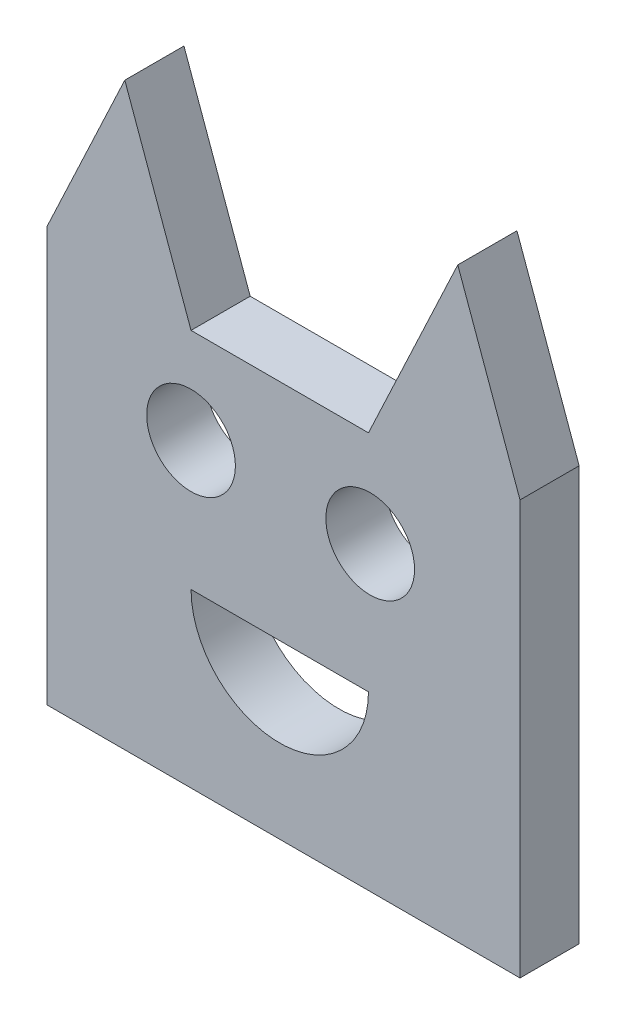
ISO-10303-21;
HEADER;
FILE_DESCRIPTION(('STEP AP214'),'2;1');
FILE_NAME('part.step','',(''),(''),'','','');
FILE_SCHEMA(('AUTOMOTIVE_DESIGN { 1 0 10303 214 1 1 1 1 }'));
ENDSEC;
DATA;
#1=APPLICATION_CONTEXT('core data for automotive mechanical design processes');
#2=APPLICATION_PROTOCOL_DEFINITION('international standard','automotive_design',2000,#1);
#3=PRODUCT_CONTEXT('',#1,'mechanical');
#4=PRODUCT('Part','Part','',(#3));
#5=PRODUCT_RELATED_PRODUCT_CATEGORY('part','',(#4));
#6=PRODUCT_DEFINITION_FORMATION('','',#4);
#7=PRODUCT_DEFINITION_CONTEXT('part definition',#1,'design');
#8=PRODUCT_DEFINITION('design','',#6,#7);
#9=PRODUCT_DEFINITION_SHAPE('','',#8);
#10=(LENGTH_UNIT() NAMED_UNIT(*) SI_UNIT(.MILLI.,.METRE.));
#11=(NAMED_UNIT(*) PLANE_ANGLE_UNIT() SI_UNIT($,.RADIAN.));
#12=(NAMED_UNIT(*) SI_UNIT($,.STERADIAN.) SOLID_ANGLE_UNIT());
#13=UNCERTAINTY_MEASURE_WITH_UNIT(LENGTH_MEASURE(1.E-05),#10,'distance_accuracy_value','');
#14=(GEOMETRIC_REPRESENTATION_CONTEXT(3) GLOBAL_UNCERTAINTY_ASSIGNED_CONTEXT((#13)) GLOBAL_UNIT_ASSIGNED_CONTEXT((#10,
#11,#12)) REPRESENTATION_CONTEXT('',''));
#15=CARTESIAN_POINT('',(0.,0.,0.));
#16=DIRECTION('',(0.,0.,1.));
#17=DIRECTION('',(1.,0.,0.));
#18=AXIS2_PLACEMENT_3D('',#15,#16,#17);
#19=CARTESIAN_POINT('',(15.6205948019353,-67.0160214677558,-10.));
#20=DIRECTION('',(0.,-1.,0.));
#21=DIRECTION('',(0.,0.,-1.));
#22=AXIS2_PLACEMENT_3D('',#19,#20,#21);
#23=PLANE('',#22);
#24=DIRECTION('',(1.,0.,0.));
#25=VECTOR('',#24,1.);
#26=CARTESIAN_POINT('',(15.6205948019353,-67.0160214677558,0.));
#27=LINE('',#26,#25);
#28=CARTESIAN_POINT('',(-24.3794051980646,-67.0160214677558,0.));
#29=VERTEX_POINT('',#28);
#30=CARTESIAN_POINT('',(55.6205948019354,-67.0160214677558,0.));
#31=VERTEX_POINT('',#30);
#32=EDGE_CURVE('E153',#29,#31,#27,.T.);
#33=ORIENTED_EDGE('',*,*,#32,.F.);
#34=DIRECTION('',(0.,0.,1.));
#35=VECTOR('',#34,1.);
#36=CARTESIAN_POINT('',(-24.3794051980646,-67.0160214677558,-10.));
#37=LINE('',#36,#35);
#38=CARTESIAN_POINT('',(-24.3794051980646,-67.0160214677558,-10.));
#39=VERTEX_POINT('',#38);
#40=EDGE_CURVE('E11',#39,#29,#37,.T.);
#41=ORIENTED_EDGE('',*,*,#40,.F.);
#42=DIRECTION('',(1.,0.,0.));
#43=VECTOR('',#42,1.);
#44=CARTESIAN_POINT('',(15.6205948019353,-67.0160214677558,-10.));
#45=LINE('',#44,#43);
#46=CARTESIAN_POINT('',(55.6205948019354,-67.0160214677558,-10.));
#47=VERTEX_POINT('',#46);
#48=EDGE_CURVE('E232',#39,#47,#45,.T.);
#49=ORIENTED_EDGE('',*,*,#48,.T.);
#50=DIRECTION('',(0.,0.,1.));
#51=VECTOR('',#50,1.);
#52=CARTESIAN_POINT('',(55.6205948019354,-67.0160214677558,-10.));
#53=LINE('',#52,#51);
#54=EDGE_CURVE('E185',#47,#31,#53,.T.);
#55=ORIENTED_EDGE('',*,*,#54,.T.);
#56=EDGE_LOOP('',(#33,#41,#49,#55));
#57=FACE_BOUND('',#56,.T.);
#58=ADVANCED_FACE('F31',(#57),#23,.T.);
#59=CARTESIAN_POINT('',(-24.3794051980646,-116.677394045434,-10.));
#60=DIRECTION('',(-1.,0.,0.));
#61=DIRECTION('',(0.,0.,1.));
#62=AXIS2_PLACEMENT_3D('',#59,#60,#61);
#63=PLANE('',#62);
#64=DIRECTION('',(0.,-1.,0.));
#65=VECTOR('',#64,1.);
#66=CARTESIAN_POINT('',(-24.3794051980646,-116.677394045434,0.));
#67=LINE('',#66,#65);
#68=CARTESIAN_POINT('',(-24.3794051980646,2.98397853224426,0.));
#69=VERTEX_POINT('',#68);
#70=EDGE_CURVE('E171',#69,#29,#67,.T.);
#71=ORIENTED_EDGE('',*,*,#70,.F.);
#72=DIRECTION('',(0.,0.,1.));
#73=VECTOR('',#72,1.);
#74=CARTESIAN_POINT('',(-24.3794051980646,2.98397853224426,-10.));
#75=LINE('',#74,#73);
#76=CARTESIAN_POINT('',(-24.3794051980646,2.98397853224426,-10.));
#77=VERTEX_POINT('',#76);
#78=EDGE_CURVE('E41',#77,#69,#75,.T.);
#79=ORIENTED_EDGE('',*,*,#78,.F.);
#80=DIRECTION('',(0.,-1.,0.));
#81=VECTOR('',#80,1.);
#82=CARTESIAN_POINT('',(-24.3794051980646,-116.677394045434,-10.));
#83=LINE('',#82,#81);
#84=EDGE_CURVE('E130',#77,#39,#83,.T.);
#85=ORIENTED_EDGE('',*,*,#84,.T.);
#86=ORIENTED_EDGE('',*,*,#40,.T.);
#87=EDGE_LOOP('',(#71,#79,#85,#86));
#88=FACE_BOUND('',#87,.T.);
#89=ADVANCED_FACE('F208',(#88),#63,.T.);
#90=CARTESIAN_POINT('',(-63.1993701005455,-79.6485223919343,-10.));
#91=DIRECTION('',(-0.905096679918776,0.425205832509396,0.));
#92=DIRECTION('',(-0.425205832509396,-0.905096679918776,0.));
#93=AXIS2_PLACEMENT_3D('',#90,#91,#92);
#94=PLANE('',#93);
#95=DIRECTION('',(-0.425205832509396,-0.905096679918776,0.));
#96=VECTOR('',#95,1.);
#97=CARTESIAN_POINT('',(-63.1993701005455,-79.6485223919343,0.));
#98=LINE('',#97,#96);
#99=CARTESIAN_POINT('',(-11.1980243902734,31.0419756097263,0.));
#100=VERTEX_POINT('',#99);
#101=EDGE_CURVE('E118',#100,#69,#98,.T.);
#102=ORIENTED_EDGE('',*,*,#101,.F.);
#103=DIRECTION('',(0.,0.,1.));
#104=VECTOR('',#103,1.);
#105=CARTESIAN_POINT('',(-11.1980243902734,31.0419756097263,-10.));
#106=LINE('',#105,#104);
#107=CARTESIAN_POINT('',(-11.1980243902734,31.0419756097263,-10.));
#108=VERTEX_POINT('',#107);
#109=EDGE_CURVE('E113',#108,#100,#106,.T.);
#110=ORIENTED_EDGE('',*,*,#109,.F.);
#111=DIRECTION('',(-0.425205832509396,-0.905096679918776,0.));
#112=VECTOR('',#111,1.);
#113=CARTESIAN_POINT('',(-63.1993701005455,-79.6485223919343,-10.));
#114=LINE('',#113,#112);
#115=EDGE_CURVE('E116',#108,#77,#114,.T.);
#116=ORIENTED_EDGE('',*,*,#115,.T.);
#117=ORIENTED_EDGE('',*,*,#78,.T.);
#118=EDGE_LOOP('',(#102,#110,#116,#117));
#119=FACE_BOUND('',#118,.T.);
#120=ADVANCED_FACE('F115',(#119),#94,.T.);
#121=CARTESIAN_POINT('',(39.0420983799109,-108.228364524231,-10.));
#122=DIRECTION('',(0.940665927567464,0.339334072432526,0.));
#123=DIRECTION('',(-0.339334072432526,0.940665927567464,0.));
#124=AXIS2_PLACEMENT_3D('',#121,#122,#123);
#125=PLANE('',#124);
#126=DIRECTION('',(-0.339334072432526,0.940665927567464,0.));
#127=VECTOR('',#126,1.);
#128=CARTESIAN_POINT('',(39.0420983799109,-108.228364524231,0.));
#129=LINE('',#128,#127);
#130=CARTESIAN_POINT('',(0.,0.,0.));
#131=VERTEX_POINT('',#130);
#132=EDGE_CURVE('E168',#131,#100,#129,.T.);
#133=ORIENTED_EDGE('',*,*,#132,.F.);
#134=DIRECTION('',(0.,0.,1.));
#135=VECTOR('',#134,1.);
#136=CARTESIAN_POINT('',(0.,0.,-10.));
#137=LINE('',#136,#135);
#138=CARTESIAN_POINT('',(0.,0.,-10.));
#139=VERTEX_POINT('',#138);
#140=EDGE_CURVE('E123',#139,#131,#137,.T.);
#141=ORIENTED_EDGE('',*,*,#140,.F.);
#142=DIRECTION('',(-0.339334072432526,0.940665927567464,0.));
#143=VECTOR('',#142,1.);
#144=CARTESIAN_POINT('',(39.0420983799109,-108.228364524231,-10.));
#145=LINE('',#144,#143);
#146=EDGE_CURVE('E129',#139,#108,#145,.T.);
#147=ORIENTED_EDGE('',*,*,#146,.T.);
#148=ORIENTED_EDGE('',*,*,#109,.T.);
#149=EDGE_LOOP('',(#133,#141,#147,#148));
#150=FACE_BOUND('',#149,.T.);
#151=ADVANCED_FACE('F132',(#150),#125,.T.);
#152=CARTESIAN_POINT('',(15.6205948019353,0.,-10.));
#153=DIRECTION('',(0.,-1.,0.));
#154=DIRECTION('',(0.,0.,-1.));
#155=AXIS2_PLACEMENT_3D('',#152,#153,#154);
#156=PLANE('',#155);
#157=DIRECTION('',(1.,0.,0.));
#158=VECTOR('',#157,1.);
#159=CARTESIAN_POINT('',(15.6205948019353,0.,0.));
#160=LINE('',#159,#158);
#161=CARTESIAN_POINT('',(30.,0.,0.));
#162=VERTEX_POINT('',#161);
#163=EDGE_CURVE('E165',#131,#162,#160,.T.);
#164=ORIENTED_EDGE('',*,*,#163,.T.);
#165=DIRECTION('',(0.,0.,1.));
#166=VECTOR('',#165,1.);
#167=CARTESIAN_POINT('',(30.,0.,-10.));
#168=LINE('',#167,#166);
#169=CARTESIAN_POINT('',(30.,0.,-10.));
#170=VERTEX_POINT('',#169);
#171=EDGE_CURVE('E177',#170,#162,#168,.T.);
#172=ORIENTED_EDGE('',*,*,#171,.F.);
#173=DIRECTION('',(1.,0.,0.));
#174=VECTOR('',#173,1.);
#175=CARTESIAN_POINT('',(15.6205948019353,0.,-10.));
#176=LINE('',#175,#174);
#177=EDGE_CURVE('E134',#139,#170,#176,.T.);
#178=ORIENTED_EDGE('',*,*,#177,.F.);
#179=ORIENTED_EDGE('',*,*,#140,.T.);
#180=EDGE_LOOP('',(#164,#172,#178,#179));
#181=FACE_BOUND('',#180,.T.);
#182=ADVANCED_FACE('F245',(#181),#156,.F.);
#183=CARTESIAN_POINT('',(-17.503370100546,-101.116069620251,-10.));
#184=DIRECTION('',(0.905096679918776,-0.425205832509396,0.));
#185=DIRECTION('',(0.425205832509396,0.905096679918776,0.));
#186=AXIS2_PLACEMENT_3D('',#183,#184,#185);
#187=PLANE('',#186);
#188=DIRECTION('',(0.425205832509397,0.905096679918776,0.));
#189=VECTOR('',#188,1.);
#190=CARTESIAN_POINT('',(-17.503370100546,-101.116069620251,0.));
#191=LINE('',#190,#189);
#192=CARTESIAN_POINT('',(45.1012385565271,32.1446222868356,0.));
#193=VERTEX_POINT('',#192);
#194=EDGE_CURVE('E162',#162,#193,#191,.T.);
#195=ORIENTED_EDGE('',*,*,#194,.T.);
#196=DIRECTION('',(0.,0.,1.));
#197=VECTOR('',#196,1.);
#198=CARTESIAN_POINT('',(45.1012385565271,32.1446222868356,-10.));
#199=LINE('',#198,#197);
#200=CARTESIAN_POINT('',(45.1012385565271,32.1446222868356,-10.));
#201=VERTEX_POINT('',#200);
#202=EDGE_CURVE('E180',#201,#193,#199,.T.);
#203=ORIENTED_EDGE('',*,*,#202,.F.);
#204=DIRECTION('',(0.425205832509397,0.905096679918776,0.));
#205=VECTOR('',#204,1.);
#206=CARTESIAN_POINT('',(-17.503370100546,-101.116069620251,-10.));
#207=LINE('',#206,#205);
#208=EDGE_CURVE('E136',#170,#201,#207,.T.);
#209=ORIENTED_EDGE('',*,*,#208,.F.);
#210=ORIENTED_EDGE('',*,*,#171,.T.);
#211=EDGE_LOOP('',(#195,#203,#209,#210));
#212=FACE_BOUND('',#211,.T.);
#213=ADVANCED_FACE('F242',(#212),#187,.F.);
#214=CARTESIAN_POINT('',(89.2106004201829,-90.1306726590768,-10.));
#215=DIRECTION('',(-0.940665927567464,-0.339334072432526,0.));
#216=DIRECTION('',(0.339334072432526,-0.940665927567464,0.));
#217=AXIS2_PLACEMENT_3D('',#214,#215,#216);
#218=PLANE('',#217);
#219=DIRECTION('',(0.339334072432526,-0.940665927567464,0.));
#220=VECTOR('',#219,1.);
#221=CARTESIAN_POINT('',(89.2106004201829,-90.1306726590768,0.));
#222=LINE('',#221,#220);
#223=CARTESIAN_POINT('',(55.6205948019353,2.98397853224426,0.));
#224=VERTEX_POINT('',#223);
#225=EDGE_CURVE('E159',#193,#224,#222,.T.);
#226=ORIENTED_EDGE('',*,*,#225,.T.);
#227=DIRECTION('',(0.,0.,1.));
#228=VECTOR('',#227,1.);
#229=CARTESIAN_POINT('',(55.6205948019353,2.98397853224426,-10.));
#230=LINE('',#229,#228);
#231=CARTESIAN_POINT('',(55.6205948019353,2.98397853224426,-10.));
#232=VERTEX_POINT('',#231);
#233=EDGE_CURVE('E183',#232,#224,#230,.T.);
#234=ORIENTED_EDGE('',*,*,#233,.F.);
#235=DIRECTION('',(0.339334072432526,-0.940665927567464,0.));
#236=VECTOR('',#235,1.);
#237=CARTESIAN_POINT('',(89.2106004201829,-90.1306726590768,-10.));
#238=LINE('',#237,#236);
#239=EDGE_CURVE('E246',#201,#232,#238,.T.);
#240=ORIENTED_EDGE('',*,*,#239,.F.);
#241=ORIENTED_EDGE('',*,*,#202,.T.);
#242=EDGE_LOOP('',(#226,#234,#240,#241));
#243=FACE_BOUND('',#242,.T.);
#244=ADVANCED_FACE('F221',(#243),#218,.F.);
#245=CARTESIAN_POINT('',(15.,-37.9283783783784,-10.));
#246=DIRECTION('',(0.,0.,1.));
#247=DIRECTION('',(1.,0.,0.));
#248=AXIS2_PLACEMENT_3D('',#245,#246,#247);
#249=CYLINDRICAL_SURFACE('',#248,15.);
#250=CARTESIAN_POINT('',(15.,-37.9283783783784,0.));
#251=DIRECTION('',(0.,0.,1.));
#252=DIRECTION('',(1.,0.,0.));
#253=AXIS2_PLACEMENT_3D('',#250,#251,#252);
#254=CIRCLE('',#253,15.);
#255=CARTESIAN_POINT('',(0.,-37.9283783783784,0.));
#256=VERTEX_POINT('',#255);
#257=CARTESIAN_POINT('',(30.,-37.9283783783783,0.));
#258=VERTEX_POINT('',#257);
#259=EDGE_CURVE('E141',#256,#258,#254,.T.);
#260=ORIENTED_EDGE('',*,*,#259,.T.);
#261=DIRECTION('',(0.,0.,1.));
#262=VECTOR('',#261,1.);
#263=CARTESIAN_POINT('',(30.,-37.9283783783783,-10.));
#264=LINE('',#263,#262);
#265=CARTESIAN_POINT('',(30.,-37.9283783783783,-10.));
#266=VERTEX_POINT('',#265);
#267=EDGE_CURVE('E186',#266,#258,#264,.T.);
#268=ORIENTED_EDGE('',*,*,#267,.F.);
#269=CARTESIAN_POINT('',(15.,-37.9283783783784,-10.));
#270=DIRECTION('',(0.,0.,1.));
#271=DIRECTION('',(1.,0.,0.));
#272=AXIS2_PLACEMENT_3D('',#269,#270,#271);
#273=CIRCLE('',#272,15.);
#274=CARTESIAN_POINT('',(0.,-37.9283783783784,-10.));
#275=VERTEX_POINT('',#274);
#276=EDGE_CURVE('E173',#275,#266,#273,.T.);
#277=ORIENTED_EDGE('',*,*,#276,.F.);
#278=DIRECTION('',(0.,0.,1.));
#279=VECTOR('',#278,1.);
#280=CARTESIAN_POINT('',(0.,-37.9283783783784,-10.));
#281=LINE('',#280,#279);
#282=EDGE_CURVE('E35',#275,#256,#281,.T.);
#283=ORIENTED_EDGE('',*,*,#282,.T.);
#284=EDGE_LOOP('',(#260,#268,#277,#283));
#285=FACE_BOUND('',#284,.T.);
#286=ADVANCED_FACE('F33',(#285),#249,.F.);
#287=CARTESIAN_POINT('',(0.,-16.1100470035253,-10.));
#288=DIRECTION('',(0.,0.,1.));
#289=DIRECTION('',(1.,0.,0.));
#290=AXIS2_PLACEMENT_3D('',#287,#288,#289);
#291=CYLINDRICAL_SURFACE('',#290,7.5);
#292=CARTESIAN_POINT('',(0.,-16.1100470035253,-10.));
#293=DIRECTION('',(0.,0.,1.));
#294=DIRECTION('',(1.,0.,0.));
#295=AXIS2_PLACEMENT_3D('',#292,#293,#294);
#296=CIRCLE('',#295,7.5);
#297=CARTESIAN_POINT('',(7.5,-16.1100470035253,-10.));
#298=VERTEX_POINT('',#297);
#299=EDGE_CURVE('E225',#298,#298,#296,.T.);
#300=ORIENTED_EDGE('',*,*,#299,.F.);
#301=EDGE_LOOP('',(#300));
#302=FACE_BOUND('',#301,.T.);
#303=CARTESIAN_POINT('',(0.,-16.1100470035253,0.));
#304=DIRECTION('',(0.,0.,1.));
#305=DIRECTION('',(1.,0.,0.));
#306=AXIS2_PLACEMENT_3D('',#303,#304,#305);
#307=CIRCLE('',#306,7.5);
#308=CARTESIAN_POINT('',(7.5,-16.1100470035253,0.));
#309=VERTEX_POINT('',#308);
#310=EDGE_CURVE('E150',#309,#309,#307,.T.);
#311=ORIENTED_EDGE('',*,*,#310,.T.);
#312=EDGE_LOOP('',(#311));
#313=FACE_BOUND('',#312,.T.);
#314=ADVANCED_FACE('F204',(#302,#313),#291,.F.);
#315=CARTESIAN_POINT('',(30.2917862155634,-16.1100470035253,-10.));
#316=DIRECTION('',(0.,0.,1.));
#317=DIRECTION('',(1.,0.,0.));
#318=AXIS2_PLACEMENT_3D('',#315,#316,#317);
#319=CYLINDRICAL_SURFACE('',#318,7.5);
#320=CARTESIAN_POINT('',(30.2917862155634,-16.1100470035253,-10.));
#321=DIRECTION('',(0.,0.,1.));
#322=DIRECTION('',(1.,0.,0.));
#323=AXIS2_PLACEMENT_3D('',#320,#321,#322);
#324=CIRCLE('',#323,7.5);
#325=CARTESIAN_POINT('',(37.7917862155634,-16.1100470035253,-10.));
#326=VERTEX_POINT('',#325);
#327=EDGE_CURVE('E252',#326,#326,#324,.T.);
#328=ORIENTED_EDGE('',*,*,#327,.F.);
#329=EDGE_LOOP('',(#328));
#330=FACE_BOUND('',#329,.T.);
#331=CARTESIAN_POINT('',(30.2917862155634,-16.1100470035253,0.));
#332=DIRECTION('',(0.,0.,1.));
#333=DIRECTION('',(1.,0.,0.));
#334=AXIS2_PLACEMENT_3D('',#331,#332,#333);
#335=CIRCLE('',#334,7.5);
#336=CARTESIAN_POINT('',(37.7917862155634,-16.1100470035253,0.));
#337=VERTEX_POINT('',#336);
#338=EDGE_CURVE('E147',#337,#337,#335,.T.);
#339=ORIENTED_EDGE('',*,*,#338,.T.);
#340=EDGE_LOOP('',(#339));
#341=FACE_BOUND('',#340,.T.);
#342=ADVANCED_FACE('F197',(#330,#341),#319,.F.);
#343=CARTESIAN_POINT('',(15.6205948019353,-37.9283783783784,-10.));
#344=DIRECTION('',(0.,-1.,0.));
#345=DIRECTION('',(1.,0.,0.));
#346=AXIS2_PLACEMENT_3D('',#343,#344,#345);
#347=PLANE('',#346);
#348=DIRECTION('',(1.,0.,0.));
#349=VECTOR('',#348,1.);
#350=CARTESIAN_POINT('',(15.6205948019353,-37.9283783783784,0.));
#351=LINE('',#350,#349);
#352=EDGE_CURVE('E144',#256,#258,#351,.T.);
#353=ORIENTED_EDGE('',*,*,#352,.F.);
#354=ORIENTED_EDGE('',*,*,#282,.F.);
#355=DIRECTION('',(1.,0.,0.));
#356=VECTOR('',#355,1.);
#357=CARTESIAN_POINT('',(15.6205948019353,-37.9283783783784,-10.));
#358=LINE('',#357,#356);
#359=EDGE_CURVE('E255',#275,#266,#358,.T.);
#360=ORIENTED_EDGE('',*,*,#359,.T.);
#361=ORIENTED_EDGE('',*,*,#267,.T.);
#362=EDGE_LOOP('',(#353,#354,#360,#361));
#363=FACE_BOUND('',#362,.T.);
#364=ADVANCED_FACE('F194',(#363),#347,.T.);
#365=CARTESIAN_POINT('',(55.6205948019354,-116.677394045434,-10.));
#366=DIRECTION('',(1.,0.,0.));
#367=DIRECTION('',(0.,0.,-1.));
#368=AXIS2_PLACEMENT_3D('',#365,#366,#367);
#369=PLANE('',#368);
#370=DIRECTION('',(0.,1.,0.));
#371=VECTOR('',#370,1.);
#372=CARTESIAN_POINT('',(55.6205948019354,-116.677394045434,0.));
#373=LINE('',#372,#371);
#374=EDGE_CURVE('E156',#31,#224,#373,.T.);
#375=ORIENTED_EDGE('',*,*,#374,.F.);
#376=ORIENTED_EDGE('',*,*,#54,.F.);
#377=DIRECTION('',(0.,1.,0.));
#378=VECTOR('',#377,1.);
#379=CARTESIAN_POINT('',(55.6205948019354,-116.677394045434,-10.));
#380=LINE('',#379,#378);
#381=EDGE_CURVE('E236',#47,#232,#380,.T.);
#382=ORIENTED_EDGE('',*,*,#381,.T.);
#383=ORIENTED_EDGE('',*,*,#233,.T.);
#384=EDGE_LOOP('',(#375,#376,#382,#383));
#385=FACE_BOUND('',#384,.T.);
#386=ADVANCED_FACE('F196',(#385),#369,.T.);
#387=CARTESIAN_POINT('',(15.6205948019353,-116.677394045434,-10.));
#388=DIRECTION('',(0.,0.,1.));
#389=DIRECTION('',(1.,0.,0.));
#390=AXIS2_PLACEMENT_3D('',#387,#388,#389);
#391=PLANE('',#390);
#392=ORIENTED_EDGE('',*,*,#276,.T.);
#393=ORIENTED_EDGE('',*,*,#359,.F.);
#394=EDGE_LOOP('',(#392,#393));
#395=FACE_BOUND('',#394,.T.);
#396=ORIENTED_EDGE('',*,*,#327,.T.);
#397=EDGE_LOOP('',(#396));
#398=FACE_BOUND('',#397,.T.);
#399=ORIENTED_EDGE('',*,*,#299,.T.);
#400=EDGE_LOOP('',(#399));
#401=FACE_BOUND('',#400,.T.);
#402=ORIENTED_EDGE('',*,*,#48,.F.);
#403=ORIENTED_EDGE('',*,*,#84,.F.);
#404=ORIENTED_EDGE('',*,*,#115,.F.);
#405=ORIENTED_EDGE('',*,*,#146,.F.);
#406=ORIENTED_EDGE('',*,*,#177,.T.);
#407=ORIENTED_EDGE('',*,*,#208,.T.);
#408=ORIENTED_EDGE('',*,*,#239,.T.);
#409=ORIENTED_EDGE('',*,*,#381,.F.);
#410=EDGE_LOOP('',(#402,#403,#404,#405,#406,#407,#408,#409));
#411=FACE_BOUND('',#410,.T.);
#412=ADVANCED_FACE('F127',(#395,#398,#401,#411),#391,.F.);
#413=CARTESIAN_POINT('',(15.6205948019353,-116.677394045434,0.));
#414=DIRECTION('',(0.,0.,1.));
#415=DIRECTION('',(1.,0.,0.));
#416=AXIS2_PLACEMENT_3D('',#413,#414,#415);
#417=PLANE('',#416);
#418=ORIENTED_EDGE('',*,*,#259,.F.);
#419=ORIENTED_EDGE('',*,*,#352,.T.);
#420=EDGE_LOOP('',(#418,#419));
#421=FACE_BOUND('',#420,.T.);
#422=ORIENTED_EDGE('',*,*,#338,.F.);
#423=EDGE_LOOP('',(#422));
#424=FACE_BOUND('',#423,.T.);
#425=ORIENTED_EDGE('',*,*,#310,.F.);
#426=EDGE_LOOP('',(#425));
#427=FACE_BOUND('',#426,.T.);
#428=ORIENTED_EDGE('',*,*,#32,.T.);
#429=ORIENTED_EDGE('',*,*,#374,.T.);
#430=ORIENTED_EDGE('',*,*,#225,.F.);
#431=ORIENTED_EDGE('',*,*,#194,.F.);
#432=ORIENTED_EDGE('',*,*,#163,.F.);
#433=ORIENTED_EDGE('',*,*,#132,.T.);
#434=ORIENTED_EDGE('',*,*,#101,.T.);
#435=ORIENTED_EDGE('',*,*,#70,.T.);
#436=EDGE_LOOP('',(#428,#429,#430,#431,#432,#433,#434,#435));
#437=FACE_BOUND('',#436,.T.);
#438=ADVANCED_FACE('F192',(#421,#424,#427,#437),#417,.T.);
#439=CLOSED_SHELL('',(#58,#89,#120,#151,#182,#213,#244,#286,#314,#342,#364,#386,#412,#438));
#440=MANIFOLD_SOLID_BREP('B2',#439);
#441=ADVANCED_BREP_SHAPE_REPRESENTATION('',(#18,#440),#14);
#442=SHAPE_DEFINITION_REPRESENTATION(#9,#441);
ENDSEC;
END-ISO-10303-21;
